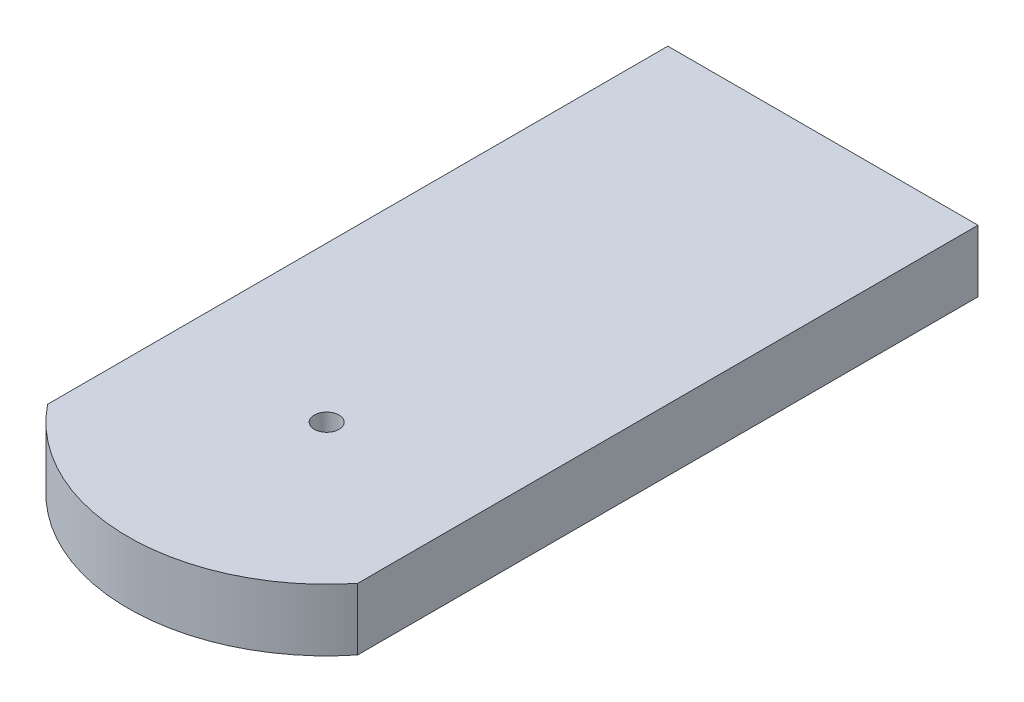
ISO-10303-21;
HEADER;
FILE_DESCRIPTION(('STEP AP214'),'2;1');
FILE_NAME('part.step','',(''),(''),'','','');
FILE_SCHEMA(('AUTOMOTIVE_DESIGN { 1 0 10303 214 1 1 1 1 }'));
ENDSEC;
DATA;
#1=APPLICATION_CONTEXT('core data for automotive mechanical design processes');
#2=APPLICATION_PROTOCOL_DEFINITION('international standard','automotive_design',2000,#1);
#3=PRODUCT_CONTEXT('',#1,'mechanical');
#4=PRODUCT('Part','Part','',(#3));
#5=PRODUCT_RELATED_PRODUCT_CATEGORY('part','',(#4));
#6=PRODUCT_DEFINITION_FORMATION('','',#4);
#7=PRODUCT_DEFINITION_CONTEXT('part definition',#1,'design');
#8=PRODUCT_DEFINITION('design','',#6,#7);
#9=PRODUCT_DEFINITION_SHAPE('','',#8);
#10=(LENGTH_UNIT() NAMED_UNIT(*) SI_UNIT(.MILLI.,.METRE.));
#11=(NAMED_UNIT(*) PLANE_ANGLE_UNIT() SI_UNIT($,.RADIAN.));
#12=(NAMED_UNIT(*) SI_UNIT($,.STERADIAN.) SOLID_ANGLE_UNIT());
#13=UNCERTAINTY_MEASURE_WITH_UNIT(LENGTH_MEASURE(1.E-05),#10,'distance_accuracy_value','');
#14=(GEOMETRIC_REPRESENTATION_CONTEXT(3) GLOBAL_UNCERTAINTY_ASSIGNED_CONTEXT((#13)) GLOBAL_UNIT_ASSIGNED_CONTEXT((#10,
#11,#12)) REPRESENTATION_CONTEXT('',''));
#15=CARTESIAN_POINT('',(0.,0.,0.));
#16=DIRECTION('',(0.,0.,1.));
#17=DIRECTION('',(1.,0.,0.));
#18=AXIS2_PLACEMENT_3D('',#15,#16,#17);
#19=CARTESIAN_POINT('',(25.,10.,0.));
#20=DIRECTION('',(1.,0.,0.));
#21=DIRECTION('',(0.,0.,-1.));
#22=AXIS2_PLACEMENT_3D('',#19,#20,#21);
#23=PLANE('',#22);
#24=DIRECTION('',(0.,0.,1.));
#25=VECTOR('',#24,1.);
#26=CARTESIAN_POINT('',(25.,0.,0.));
#27=LINE('',#26,#25);
#28=CARTESIAN_POINT('',(25.,0.,-50.));
#29=VERTEX_POINT('',#28);
#30=CARTESIAN_POINT('',(25.,0.,50.));
#31=VERTEX_POINT('',#30);
#32=EDGE_CURVE('E105',#29,#31,#27,.T.);
#33=ORIENTED_EDGE('',*,*,#32,.F.);
#34=DIRECTION('',(0.,-1.,0.));
#35=VECTOR('',#34,1.);
#36=CARTESIAN_POINT('',(25.,10.,-50.));
#37=LINE('',#36,#35);
#38=CARTESIAN_POINT('',(25.,10.,-50.));
#39=VERTEX_POINT('',#38);
#40=EDGE_CURVE('E11',#39,#29,#37,.T.);
#41=ORIENTED_EDGE('',*,*,#40,.F.);
#42=DIRECTION('',(0.,0.,1.));
#43=VECTOR('',#42,1.);
#44=CARTESIAN_POINT('',(25.,10.,0.));
#45=LINE('',#44,#43);
#46=CARTESIAN_POINT('',(25.,10.,50.));
#47=VERTEX_POINT('',#46);
#48=EDGE_CURVE('E95',#39,#47,#45,.T.);
#49=ORIENTED_EDGE('',*,*,#48,.T.);
#50=DIRECTION('',(0.,-1.,0.));
#51=VECTOR('',#50,1.);
#52=CARTESIAN_POINT('',(25.,10.,50.));
#53=LINE('',#52,#51);
#54=EDGE_CURVE('E74',#47,#31,#53,.T.);
#55=ORIENTED_EDGE('',*,*,#54,.T.);
#56=EDGE_LOOP('',(#33,#41,#49,#55));
#57=FACE_BOUND('',#56,.T.);
#58=ADVANCED_FACE('F34',(#57),#23,.T.);
#59=CARTESIAN_POINT('',(0.,10.,-50.));
#60=DIRECTION('',(0.,0.,-1.));
#61=DIRECTION('',(-1.,0.,0.));
#62=AXIS2_PLACEMENT_3D('',#59,#60,#61);
#63=PLANE('',#62);
#64=DIRECTION('',(1.,0.,0.));
#65=VECTOR('',#64,1.);
#66=CARTESIAN_POINT('',(0.,0.,-50.));
#67=LINE('',#66,#65);
#68=CARTESIAN_POINT('',(-25.,0.,-50.));
#69=VERTEX_POINT('',#68);
#70=EDGE_CURVE('E86',#69,#29,#67,.T.);
#71=ORIENTED_EDGE('',*,*,#70,.F.);
#72=DIRECTION('',(0.,-1.,0.));
#73=VECTOR('',#72,1.);
#74=CARTESIAN_POINT('',(-25.,10.,-50.));
#75=LINE('',#74,#73);
#76=CARTESIAN_POINT('',(-25.,10.,-50.));
#77=VERTEX_POINT('',#76);
#78=EDGE_CURVE('E43',#77,#69,#75,.T.);
#79=ORIENTED_EDGE('',*,*,#78,.F.);
#80=DIRECTION('',(1.,0.,0.));
#81=VECTOR('',#80,1.);
#82=CARTESIAN_POINT('',(0.,10.,-50.));
#83=LINE('',#82,#81);
#84=EDGE_CURVE('E84',#77,#39,#83,.T.);
#85=ORIENTED_EDGE('',*,*,#84,.T.);
#86=ORIENTED_EDGE('',*,*,#40,.T.);
#87=EDGE_LOOP('',(#71,#79,#85,#86));
#88=FACE_BOUND('',#87,.T.);
#89=ADVANCED_FACE('F82',(#88),#63,.T.);
#90=CARTESIAN_POINT('',(-25.,10.,0.));
#91=DIRECTION('',(1.,0.,0.));
#92=DIRECTION('',(0.,0.,-1.));
#93=AXIS2_PLACEMENT_3D('',#90,#91,#92);
#94=PLANE('',#93);
#95=DIRECTION('',(0.,0.,1.));
#96=VECTOR('',#95,1.);
#97=CARTESIAN_POINT('',(-25.,0.,0.));
#98=LINE('',#97,#96);
#99=CARTESIAN_POINT('',(-25.,0.,50.));
#100=VERTEX_POINT('',#99);
#101=EDGE_CURVE('E108',#69,#100,#98,.T.);
#102=ORIENTED_EDGE('',*,*,#101,.T.);
#103=DIRECTION('',(0.,-1.,0.));
#104=VECTOR('',#103,1.);
#105=CARTESIAN_POINT('',(-25.,10.,50.));
#106=LINE('',#105,#104);
#107=CARTESIAN_POINT('',(-25.,10.,50.));
#108=VERTEX_POINT('',#107);
#109=EDGE_CURVE('E89',#108,#100,#106,.T.);
#110=ORIENTED_EDGE('',*,*,#109,.F.);
#111=DIRECTION('',(0.,0.,1.));
#112=VECTOR('',#111,1.);
#113=CARTESIAN_POINT('',(-25.,10.,0.));
#114=LINE('',#113,#112);
#115=EDGE_CURVE('E91',#77,#108,#114,.T.);
#116=ORIENTED_EDGE('',*,*,#115,.F.);
#117=ORIENTED_EDGE('',*,*,#78,.T.);
#118=EDGE_LOOP('',(#102,#110,#116,#117));
#119=FACE_BOUND('',#118,.T.);
#120=ADVANCED_FACE('F92',(#119),#94,.F.);
#121=CARTESIAN_POINT('',(0.,10.,30.0000000000006));
#122=DIRECTION('',(0.,-1.,0.));
#123=DIRECTION('',(0.,0.,-1.));
#124=AXIS2_PLACEMENT_3D('',#121,#122,#123);
#125=CYLINDRICAL_SURFACE('',#124,2.);
#126=CARTESIAN_POINT('',(0.,10.,30.0000000000006));
#127=DIRECTION('',(0.,1.,0.));
#128=DIRECTION('',(0.,0.,1.));
#129=AXIS2_PLACEMENT_3D('',#126,#127,#128);
#130=CIRCLE('',#129,2.);
#131=CARTESIAN_POINT('',(0.,10.,32.0000000000006));
#132=VERTEX_POINT('',#131);
#133=EDGE_CURVE('E97',#132,#132,#130,.T.);
#134=ORIENTED_EDGE('',*,*,#133,.T.);
#135=EDGE_LOOP('',(#134));
#136=FACE_BOUND('',#135,.T.);
#137=CARTESIAN_POINT('',(0.,0.,30.0000000000006));
#138=DIRECTION('',(0.,1.,0.));
#139=DIRECTION('',(0.,0.,1.));
#140=AXIS2_PLACEMENT_3D('',#137,#138,#139);
#141=CIRCLE('',#140,2.);
#142=CARTESIAN_POINT('',(0.,0.,32.0000000000006));
#143=VERTEX_POINT('',#142);
#144=EDGE_CURVE('E102',#143,#143,#141,.T.);
#145=ORIENTED_EDGE('',*,*,#144,.F.);
#146=EDGE_LOOP('',(#145));
#147=FACE_BOUND('',#146,.T.);
#148=ADVANCED_FACE('F36',(#136,#147),#125,.F.);
#149=CARTESIAN_POINT('',(0.,10.,30.0000000000006));
#150=DIRECTION('',(0.,-1.,0.));
#151=DIRECTION('',(0.,0.,-1.));
#152=AXIS2_PLACEMENT_3D('',#149,#150,#151);
#153=CYLINDRICAL_SURFACE('',#152,32.0156211871639);
#154=CARTESIAN_POINT('',(0.,0.,30.0000000000006));
#155=DIRECTION('',(0.,1.,0.));
#156=DIRECTION('',(0.,0.,1.));
#157=AXIS2_PLACEMENT_3D('',#154,#155,#156);
#158=CIRCLE('',#157,32.0156211871639);
#159=EDGE_CURVE('E67',#100,#31,#158,.T.);
#160=ORIENTED_EDGE('',*,*,#159,.T.);
#161=ORIENTED_EDGE('',*,*,#54,.F.);
#162=CARTESIAN_POINT('',(0.,10.,30.0000000000006));
#163=DIRECTION('',(0.,1.,0.));
#164=DIRECTION('',(0.,0.,1.));
#165=AXIS2_PLACEMENT_3D('',#162,#163,#164);
#166=CIRCLE('',#165,32.0156211871639);
#167=EDGE_CURVE('E51',#108,#47,#166,.T.);
#168=ORIENTED_EDGE('',*,*,#167,.F.);
#169=ORIENTED_EDGE('',*,*,#109,.T.);
#170=EDGE_LOOP('',(#160,#161,#168,#169));
#171=FACE_BOUND('',#170,.T.);
#172=ADVANCED_FACE('F113',(#171),#153,.T.);
#173=CARTESIAN_POINT('',(0.,10.,0.));
#174=DIRECTION('',(0.,1.,0.));
#175=DIRECTION('',(0.,0.,1.));
#176=AXIS2_PLACEMENT_3D('',#173,#174,#175);
#177=PLANE('',#176);
#178=ORIENTED_EDGE('',*,*,#133,.F.);
#179=EDGE_LOOP('',(#178));
#180=FACE_BOUND('',#179,.T.);
#181=ORIENTED_EDGE('',*,*,#48,.F.);
#182=ORIENTED_EDGE('',*,*,#84,.F.);
#183=ORIENTED_EDGE('',*,*,#115,.T.);
#184=ORIENTED_EDGE('',*,*,#167,.T.);
#185=EDGE_LOOP('',(#181,#182,#183,#184));
#186=FACE_BOUND('',#185,.T.);
#187=ADVANCED_FACE('F94',(#180,#186),#177,.T.);
#188=CARTESIAN_POINT('',(0.,0.,0.));
#189=DIRECTION('',(0.,1.,0.));
#190=DIRECTION('',(0.,0.,1.));
#191=AXIS2_PLACEMENT_3D('',#188,#189,#190);
#192=PLANE('',#191);
#193=ORIENTED_EDGE('',*,*,#144,.T.);
#194=EDGE_LOOP('',(#193));
#195=FACE_BOUND('',#194,.T.);
#196=ORIENTED_EDGE('',*,*,#32,.T.);
#197=ORIENTED_EDGE('',*,*,#159,.F.);
#198=ORIENTED_EDGE('',*,*,#101,.F.);
#199=ORIENTED_EDGE('',*,*,#70,.T.);
#200=EDGE_LOOP('',(#196,#197,#198,#199));
#201=FACE_BOUND('',#200,.T.);
#202=ADVANCED_FACE('F114',(#195,#201),#192,.F.);
#203=CLOSED_SHELL('',(#58,#89,#120,#148,#172,#187,#202));
#204=MANIFOLD_SOLID_BREP('B2',#203);
#205=ADVANCED_BREP_SHAPE_REPRESENTATION('',(#18,#204),#14);
#206=SHAPE_DEFINITION_REPRESENTATION(#9,#205);
ENDSEC;
END-ISO-10303-21;
